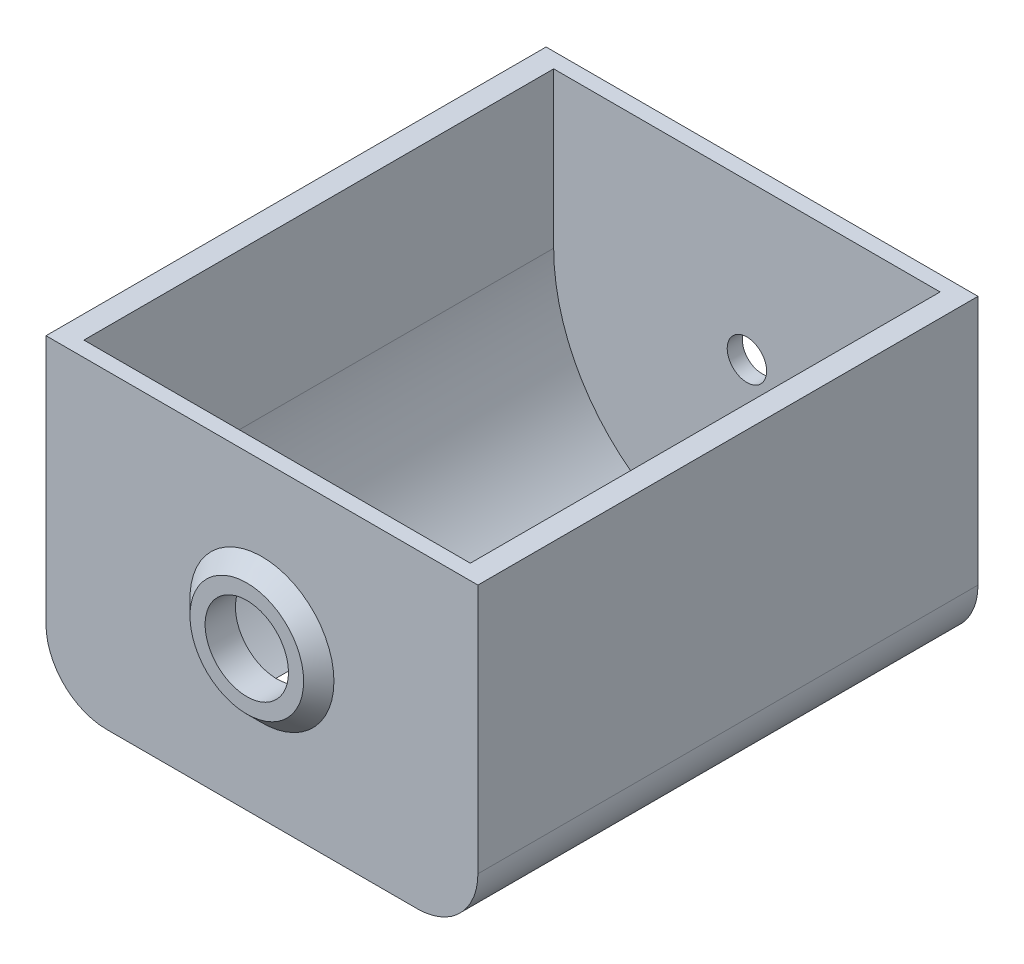
ISO-10303-21;
HEADER;
FILE_DESCRIPTION(('STEP AP214'),'2;1');
FILE_NAME('part.step','',(''),(''),'','','');
FILE_SCHEMA(('AUTOMOTIVE_DESIGN { 1 0 10303 214 1 1 1 1 }'));
ENDSEC;
DATA;
#1=APPLICATION_CONTEXT('core data for automotive mechanical design processes');
#2=APPLICATION_PROTOCOL_DEFINITION('international standard','automotive_design',2000,#1);
#3=PRODUCT_CONTEXT('',#1,'mechanical');
#4=PRODUCT('Part','Part','',(#3));
#5=PRODUCT_RELATED_PRODUCT_CATEGORY('part','',(#4));
#6=PRODUCT_DEFINITION_FORMATION('','',#4);
#7=PRODUCT_DEFINITION_CONTEXT('part definition',#1,'design');
#8=PRODUCT_DEFINITION('design','',#6,#7);
#9=PRODUCT_DEFINITION_SHAPE('','',#8);
#10=(LENGTH_UNIT() NAMED_UNIT(*) SI_UNIT(.MILLI.,.METRE.));
#11=(NAMED_UNIT(*) PLANE_ANGLE_UNIT() SI_UNIT($,.RADIAN.));
#12=(NAMED_UNIT(*) SI_UNIT($,.STERADIAN.) SOLID_ANGLE_UNIT());
#13=UNCERTAINTY_MEASURE_WITH_UNIT(LENGTH_MEASURE(1.E-05),#10,'distance_accuracy_value','');
#14=(GEOMETRIC_REPRESENTATION_CONTEXT(3) GLOBAL_UNCERTAINTY_ASSIGNED_CONTEXT((#13)) GLOBAL_UNIT_ASSIGNED_CONTEXT((#10,
#11,#12)) REPRESENTATION_CONTEXT('',''));
#15=CARTESIAN_POINT('',(0.,0.,0.));
#16=DIRECTION('',(0.,0.,1.));
#17=DIRECTION('',(1.,0.,0.));
#18=AXIS2_PLACEMENT_3D('',#15,#16,#17);
#19=CARTESIAN_POINT('',(0.,0.,64.));
#20=DIRECTION('',(0.,0.,1.));
#21=DIRECTION('',(1.,0.,0.));
#22=AXIS2_PLACEMENT_3D('',#19,#20,#21);
#23=PLANE('',#22);
#24=CARTESIAN_POINT('',(0.,0.,64.));
#25=DIRECTION('',(0.,0.,1.));
#26=DIRECTION('',(1.,0.,0.));
#27=AXIS2_PLACEMENT_3D('',#24,#25,#26);
#28=CIRCLE('',#27,9.49999999999997);
#29=CARTESIAN_POINT('',(9.49999999999997,0.,64.));
#30=VERTEX_POINT('',#29);
#31=EDGE_CURVE('E222',#30,#30,#28,.F.);
#32=ORIENTED_EDGE('',*,*,#31,.T.);
#33=EDGE_LOOP('',(#32));
#34=FACE_BOUND('',#33,.T.);
#35=DIRECTION('',(0.,-1.,0.));
#36=VECTOR('',#35,1.);
#37=CARTESIAN_POINT('',(-28.5,20.5,64.));
#38=LINE('',#37,#36);
#39=CARTESIAN_POINT('',(-28.5,20.5,64.));
#40=VERTEX_POINT('',#39);
#41=CARTESIAN_POINT('',(-28.5,-12.5,64.));
#42=VERTEX_POINT('',#41);
#43=EDGE_CURVE('E141',#40,#42,#38,.T.);
#44=ORIENTED_EDGE('',*,*,#43,.T.);
#45=CARTESIAN_POINT('',(-20.5,-12.5,64.));
#46=DIRECTION('',(0.,0.,1.));
#47=DIRECTION('',(1.,0.,0.));
#48=AXIS2_PLACEMENT_3D('',#45,#46,#47);
#49=CIRCLE('',#48,8.);
#50=CARTESIAN_POINT('',(-20.5,-20.5,64.));
#51=VERTEX_POINT('',#50);
#52=EDGE_CURVE('E43',#42,#51,#49,.T.);
#53=ORIENTED_EDGE('',*,*,#52,.T.);
#54=DIRECTION('',(1.,0.,0.));
#55=VECTOR('',#54,1.);
#56=CARTESIAN_POINT('',(-28.5,-20.5,64.));
#57=LINE('',#56,#55);
#58=CARTESIAN_POINT('',(20.5,-20.5,64.));
#59=VERTEX_POINT('',#58);
#60=EDGE_CURVE('E192',#51,#59,#57,.T.);
#61=ORIENTED_EDGE('',*,*,#60,.T.);
#62=CARTESIAN_POINT('',(20.5,-12.5,64.));
#63=DIRECTION('',(0.,0.,1.));
#64=DIRECTION('',(1.,0.,0.));
#65=AXIS2_PLACEMENT_3D('',#62,#63,#64);
#66=CIRCLE('',#65,8.);
#67=CARTESIAN_POINT('',(28.5,-12.5,64.));
#68=VERTEX_POINT('',#67);
#69=EDGE_CURVE('E50',#59,#68,#66,.T.);
#70=ORIENTED_EDGE('',*,*,#69,.T.);
#71=DIRECTION('',(0.,1.,0.));
#72=VECTOR('',#71,1.);
#73=CARTESIAN_POINT('',(28.5,20.5,64.));
#74=LINE('',#73,#72);
#75=CARTESIAN_POINT('',(28.5,20.5,64.));
#76=VERTEX_POINT('',#75);
#77=EDGE_CURVE('E195',#68,#76,#74,.T.);
#78=ORIENTED_EDGE('',*,*,#77,.T.);
#79=DIRECTION('',(-1.,0.,0.));
#80=VECTOR('',#79,1.);
#81=CARTESIAN_POINT('',(-28.5,20.5,64.));
#82=LINE('',#81,#80);
#83=EDGE_CURVE('E145',#76,#40,#82,.T.);
#84=ORIENTED_EDGE('',*,*,#83,.T.);
#85=EDGE_LOOP('',(#44,#53,#61,#70,#78,#84));
#86=FACE_BOUND('',#85,.T.);
#87=ADVANCED_FACE('F35',(#34,#86),#23,.T.);
#88=CARTESIAN_POINT('',(0.,0.,62.));
#89=DIRECTION('',(0.,0.,1.));
#90=DIRECTION('',(1.,0.,0.));
#91=AXIS2_PLACEMENT_3D('',#88,#89,#90);
#92=PLANE('',#91);
#93=CARTESIAN_POINT('',(0.,0.,62.));
#94=DIRECTION('',(0.,0.,1.));
#95=DIRECTION('',(1.,0.,0.));
#96=AXIS2_PLACEMENT_3D('',#93,#94,#95);
#97=CIRCLE('',#96,5.5);
#98=CARTESIAN_POINT('',(5.5,0.,62.));
#99=VERTEX_POINT('',#98);
#100=EDGE_CURVE('E187',#99,#99,#97,.T.);
#101=ORIENTED_EDGE('',*,*,#100,.T.);
#102=EDGE_LOOP('',(#101));
#103=FACE_BOUND('',#102,.T.);
#104=CARTESIAN_POINT('',(0.,0.,62.));
#105=DIRECTION('',(0.,0.,-1.));
#106=DIRECTION('',(1.,0.,0.));
#107=AXIS2_PLACEMENT_3D('',#104,#105,#106);
#108=CIRCLE('',#107,25.5);
#109=CARTESIAN_POINT('',(-15.1657508881031,-20.5,62.));
#110=VERTEX_POINT('',#109);
#111=CARTESIAN_POINT('',(-25.5,0.,62.));
#112=VERTEX_POINT('',#111);
#113=EDGE_CURVE('E167',#110,#112,#108,.T.);
#114=ORIENTED_EDGE('',*,*,#113,.T.);
#115=DIRECTION('',(0.,1.,0.));
#116=VECTOR('',#115,1.);
#117=CARTESIAN_POINT('',(-25.5,0.,62.));
#118=LINE('',#117,#116);
#119=CARTESIAN_POINT('',(-25.5,20.5,62.));
#120=VERTEX_POINT('',#119);
#121=EDGE_CURVE('E170',#112,#120,#118,.T.);
#122=ORIENTED_EDGE('',*,*,#121,.T.);
#123=DIRECTION('',(-1.,0.,0.));
#124=VECTOR('',#123,1.);
#125=CARTESIAN_POINT('',(-28.5,20.5,62.));
#126=LINE('',#125,#124);
#127=CARTESIAN_POINT('',(25.5,20.5,62.));
#128=VERTEX_POINT('',#127);
#129=EDGE_CURVE('E193',#128,#120,#126,.T.);
#130=ORIENTED_EDGE('',*,*,#129,.F.);
#131=DIRECTION('',(0.,-1.,0.));
#132=VECTOR('',#131,1.);
#133=CARTESIAN_POINT('',(25.5,0.,62.));
#134=LINE('',#133,#132);
#135=CARTESIAN_POINT('',(25.5,0.,62.));
#136=VERTEX_POINT('',#135);
#137=EDGE_CURVE('E204',#128,#136,#134,.T.);
#138=ORIENTED_EDGE('',*,*,#137,.T.);
#139=CARTESIAN_POINT('',(0.,0.,62.));
#140=DIRECTION('',(0.,0.,-1.));
#141=DIRECTION('',(1.,0.,0.));
#142=AXIS2_PLACEMENT_3D('',#139,#140,#141);
#143=CIRCLE('',#142,25.5);
#144=CARTESIAN_POINT('',(15.1657508881031,-20.5,62.));
#145=VERTEX_POINT('',#144);
#146=EDGE_CURVE('E201',#136,#145,#143,.T.);
#147=ORIENTED_EDGE('',*,*,#146,.T.);
#148=DIRECTION('',(1.,0.,0.));
#149=VECTOR('',#148,1.);
#150=CARTESIAN_POINT('',(-28.5,-20.5,62.));
#151=LINE('',#150,#149);
#152=EDGE_CURVE('E190',#110,#145,#151,.T.);
#153=ORIENTED_EDGE('',*,*,#152,.F.);
#154=EDGE_LOOP('',(#114,#122,#130,#138,#147,#153));
#155=FACE_BOUND('',#154,.T.);
#156=ADVANCED_FACE('F255',(#103,#155),#92,.F.);
#157=CARTESIAN_POINT('',(0.,0.,62.));
#158=DIRECTION('',(0.,0.,-1.));
#159=DIRECTION('',(-1.,0.,0.));
#160=AXIS2_PLACEMENT_3D('',#157,#158,#159);
#161=CYLINDRICAL_SURFACE('',#160,25.5);
#162=CARTESIAN_POINT('',(0.,0.,0.));
#163=DIRECTION('',(0.,0.,-1.));
#164=DIRECTION('',(1.,0.,0.));
#165=AXIS2_PLACEMENT_3D('',#162,#163,#164);
#166=CIRCLE('',#165,25.5);
#167=CARTESIAN_POINT('',(25.5,0.,0.));
#168=VERTEX_POINT('',#167);
#169=CARTESIAN_POINT('',(15.1657508881031,-20.5,0.));
#170=VERTEX_POINT('',#169);
#171=EDGE_CURVE('E144',#168,#170,#166,.T.);
#172=ORIENTED_EDGE('',*,*,#171,.T.);
#173=DIRECTION('',(0.,0.,-1.));
#174=VECTOR('',#173,1.);
#175=CARTESIAN_POINT('',(15.1657508881031,-20.5,62.));
#176=LINE('',#175,#174);
#177=EDGE_CURVE('E219',#145,#170,#176,.T.);
#178=ORIENTED_EDGE('',*,*,#177,.F.);
#179=ORIENTED_EDGE('',*,*,#146,.F.);
#180=DIRECTION('',(0.,0.,-1.));
#181=VECTOR('',#180,1.);
#182=CARTESIAN_POINT('',(25.5,0.,62.));
#183=LINE('',#182,#181);
#184=EDGE_CURVE('E208',#136,#168,#183,.T.);
#185=ORIENTED_EDGE('',*,*,#184,.T.);
#186=EDGE_LOOP('',(#172,#178,#179,#185));
#187=FACE_BOUND('',#186,.T.);
#188=ADVANCED_FACE('F261',(#187),#161,.F.);
#189=CARTESIAN_POINT('',(28.5,-20.5,62.));
#190=DIRECTION('',(0.,1.,0.));
#191=DIRECTION('',(-1.,0.,0.));
#192=AXIS2_PLACEMENT_3D('',#189,#190,#191);
#193=PLANE('',#192);
#194=ORIENTED_EDGE('',*,*,#60,.F.);
#195=DIRECTION('',(0.,0.,-1.));
#196=VECTOR('',#195,1.);
#197=CARTESIAN_POINT('',(-20.5,-20.5,62.));
#198=LINE('',#197,#196);
#199=CARTESIAN_POINT('',(-20.5,-20.5,-2.));
#200=VERTEX_POINT('',#199);
#201=EDGE_CURVE('E227',#51,#200,#198,.T.);
#202=ORIENTED_EDGE('',*,*,#201,.T.);
#203=DIRECTION('',(-1.,0.,0.));
#204=VECTOR('',#203,1.);
#205=CARTESIAN_POINT('',(28.5,-20.5,-2.));
#206=LINE('',#205,#204);
#207=CARTESIAN_POINT('',(20.5,-20.5,-2.));
#208=VERTEX_POINT('',#207);
#209=EDGE_CURVE('E136',#208,#200,#206,.T.);
#210=ORIENTED_EDGE('',*,*,#209,.F.);
#211=DIRECTION('',(0.,0.,-1.));
#212=VECTOR('',#211,1.);
#213=CARTESIAN_POINT('',(20.5,-20.5,62.));
#214=LINE('',#213,#212);
#215=EDGE_CURVE('E225',#208,#59,#214,.F.);
#216=ORIENTED_EDGE('',*,*,#215,.T.);
#217=EDGE_LOOP('',(#194,#202,#210,#216));
#218=FACE_BOUND('',#217,.T.);
#219=ORIENTED_EDGE('',*,*,#177,.T.);
#220=DIRECTION('',(-1.,0.,0.));
#221=VECTOR('',#220,1.);
#222=CARTESIAN_POINT('',(28.5,-20.5,0.));
#223=LINE('',#222,#221);
#224=CARTESIAN_POINT('',(-15.1657508881031,-20.5,0.));
#225=VERTEX_POINT('',#224);
#226=EDGE_CURVE('E157',#170,#225,#223,.T.);
#227=ORIENTED_EDGE('',*,*,#226,.T.);
#228=DIRECTION('',(0.,0.,-1.));
#229=VECTOR('',#228,1.);
#230=CARTESIAN_POINT('',(-15.1657508881031,-20.5,62.));
#231=LINE('',#230,#229);
#232=EDGE_CURVE('E184',#110,#225,#231,.T.);
#233=ORIENTED_EDGE('',*,*,#232,.F.);
#234=ORIENTED_EDGE('',*,*,#152,.T.);
#235=EDGE_LOOP('',(#219,#227,#233,#234));
#236=FACE_BOUND('',#235,.T.);
#237=ADVANCED_FACE('F239',(#218,#236),#193,.F.);
#238=CARTESIAN_POINT('',(28.5,-20.5,62.));
#239=DIRECTION('',(-1.,0.,0.));
#240=DIRECTION('',(0.,0.,1.));
#241=AXIS2_PLACEMENT_3D('',#238,#239,#240);
#242=PLANE('',#241);
#243=ORIENTED_EDGE('',*,*,#77,.F.);
#244=DIRECTION('',(0.,0.,-1.));
#245=VECTOR('',#244,1.);
#246=CARTESIAN_POINT('',(28.5,-12.5,62.));
#247=LINE('',#246,#245);
#248=CARTESIAN_POINT('',(28.5,-12.5,-2.));
#249=VERTEX_POINT('',#248);
#250=EDGE_CURVE('E11',#68,#249,#247,.T.);
#251=ORIENTED_EDGE('',*,*,#250,.T.);
#252=DIRECTION('',(0.,-1.,0.));
#253=VECTOR('',#252,1.);
#254=CARTESIAN_POINT('',(28.5,20.5,-2.));
#255=LINE('',#254,#253);
#256=CARTESIAN_POINT('',(28.5,20.5,-2.));
#257=VERTEX_POINT('',#256);
#258=EDGE_CURVE('E162',#257,#249,#255,.T.);
#259=ORIENTED_EDGE('',*,*,#258,.F.);
#260=DIRECTION('',(0.,0.,-1.));
#261=VECTOR('',#260,1.);
#262=CARTESIAN_POINT('',(28.5,20.5,62.));
#263=LINE('',#262,#261);
#264=EDGE_CURVE('E149',#76,#257,#263,.T.);
#265=ORIENTED_EDGE('',*,*,#264,.F.);
#266=EDGE_LOOP('',(#243,#251,#259,#265));
#267=FACE_BOUND('',#266,.T.);
#268=ADVANCED_FACE('F276',(#267),#242,.F.);
#269=CARTESIAN_POINT('',(28.5,20.5,62.));
#270=DIRECTION('',(0.,-1.,0.));
#271=DIRECTION('',(0.,0.,-1.));
#272=AXIS2_PLACEMENT_3D('',#269,#270,#271);
#273=PLANE('',#272);
#274=DIRECTION('',(1.,0.,0.));
#275=VECTOR('',#274,1.);
#276=CARTESIAN_POINT('',(28.5,20.5,0.));
#277=LINE('',#276,#275);
#278=CARTESIAN_POINT('',(-25.5,20.5,0.));
#279=VERTEX_POINT('',#278);
#280=CARTESIAN_POINT('',(25.5,20.5,0.));
#281=VERTEX_POINT('',#280);
#282=EDGE_CURVE('E160',#279,#281,#277,.T.);
#283=ORIENTED_EDGE('',*,*,#282,.T.);
#284=DIRECTION('',(0.,0.,-1.));
#285=VECTOR('',#284,1.);
#286=CARTESIAN_POINT('',(25.5,20.5,62.));
#287=LINE('',#286,#285);
#288=EDGE_CURVE('E215',#128,#281,#287,.T.);
#289=ORIENTED_EDGE('',*,*,#288,.F.);
#290=ORIENTED_EDGE('',*,*,#129,.T.);
#291=DIRECTION('',(0.,0.,-1.));
#292=VECTOR('',#291,1.);
#293=CARTESIAN_POINT('',(-25.5,20.5,62.));
#294=LINE('',#293,#292);
#295=EDGE_CURVE('E174',#120,#279,#294,.T.);
#296=ORIENTED_EDGE('',*,*,#295,.T.);
#297=EDGE_LOOP('',(#283,#289,#290,#296));
#298=FACE_BOUND('',#297,.T.);
#299=ORIENTED_EDGE('',*,*,#264,.T.);
#300=DIRECTION('',(1.,0.,0.));
#301=VECTOR('',#300,1.);
#302=CARTESIAN_POINT('',(28.5,20.5,-2.));
#303=LINE('',#302,#301);
#304=CARTESIAN_POINT('',(-28.5,20.5,-2.));
#305=VERTEX_POINT('',#304);
#306=EDGE_CURVE('E133',#305,#257,#303,.T.);
#307=ORIENTED_EDGE('',*,*,#306,.F.);
#308=DIRECTION('',(0.,0.,-1.));
#309=VECTOR('',#308,1.);
#310=CARTESIAN_POINT('',(-28.5,20.5,64.));
#311=LINE('',#310,#309);
#312=EDGE_CURVE('E139',#40,#305,#311,.T.);
#313=ORIENTED_EDGE('',*,*,#312,.F.);
#314=ORIENTED_EDGE('',*,*,#83,.F.);
#315=EDGE_LOOP('',(#299,#307,#313,#314));
#316=FACE_BOUND('',#315,.T.);
#317=ADVANCED_FACE('F147',(#298,#316),#273,.F.);
#318=CARTESIAN_POINT('',(25.5,0.,62.));
#319=DIRECTION('',(1.,0.,0.));
#320=DIRECTION('',(0.,0.,-1.));
#321=AXIS2_PLACEMENT_3D('',#318,#319,#320);
#322=PLANE('',#321);
#323=DIRECTION('',(0.,-1.,0.));
#324=VECTOR('',#323,1.);
#325=CARTESIAN_POINT('',(25.5,0.,0.));
#326=LINE('',#325,#324);
#327=EDGE_CURVE('E205',#281,#168,#326,.T.);
#328=ORIENTED_EDGE('',*,*,#327,.T.);
#329=ORIENTED_EDGE('',*,*,#184,.F.);
#330=ORIENTED_EDGE('',*,*,#137,.F.);
#331=ORIENTED_EDGE('',*,*,#288,.T.);
#332=EDGE_LOOP('',(#328,#329,#330,#331));
#333=FACE_BOUND('',#332,.T.);
#334=ADVANCED_FACE('F270',(#333),#322,.F.);
#335=CARTESIAN_POINT('',(-28.5,20.5,64.));
#336=DIRECTION('',(1.,0.,0.));
#337=DIRECTION('',(0.,0.,-1.));
#338=AXIS2_PLACEMENT_3D('',#335,#336,#337);
#339=PLANE('',#338);
#340=DIRECTION('',(0.,1.,0.));
#341=VECTOR('',#340,1.);
#342=CARTESIAN_POINT('',(-28.5,20.5,-2.));
#343=LINE('',#342,#341);
#344=CARTESIAN_POINT('',(-28.5,-12.5,-2.));
#345=VERTEX_POINT('',#344);
#346=EDGE_CURVE('E126',#345,#305,#343,.T.);
#347=ORIENTED_EDGE('',*,*,#346,.F.);
#348=DIRECTION('',(0.,0.,-1.));
#349=VECTOR('',#348,1.);
#350=CARTESIAN_POINT('',(-28.5,-12.5,64.));
#351=LINE('',#350,#349);
#352=EDGE_CURVE('E58',#345,#42,#351,.F.);
#353=ORIENTED_EDGE('',*,*,#352,.T.);
#354=ORIENTED_EDGE('',*,*,#43,.F.);
#355=ORIENTED_EDGE('',*,*,#312,.T.);
#356=EDGE_LOOP('',(#347,#353,#354,#355));
#357=FACE_BOUND('',#356,.T.);
#358=ADVANCED_FACE('F140',(#357),#339,.F.);
#359=CARTESIAN_POINT('',(0.,0.,64.));
#360=DIRECTION('',(0.,0.,-1.));
#361=DIRECTION('',(-1.,0.,0.));
#362=AXIS2_PLACEMENT_3D('',#359,#360,#361);
#363=CYLINDRICAL_SURFACE('',#362,5.5);
#364=ORIENTED_EDGE('',*,*,#100,.F.);
#365=EDGE_LOOP('',(#364));
#366=FACE_BOUND('',#365,.T.);
#367=CARTESIAN_POINT('',(0.,0.,66.));
#368=DIRECTION('',(0.,0.,1.));
#369=DIRECTION('',(1.,0.,0.));
#370=AXIS2_PLACEMENT_3D('',#367,#368,#369);
#371=CIRCLE('',#370,5.5);
#372=CARTESIAN_POINT('',(5.5,0.,66.));
#373=VERTEX_POINT('',#372);
#374=EDGE_CURVE('E150',#373,#373,#371,.T.);
#375=ORIENTED_EDGE('',*,*,#374,.T.);
#376=EDGE_LOOP('',(#375));
#377=FACE_BOUND('',#376,.T.);
#378=ADVANCED_FACE('F265',(#366,#377),#363,.F.);
#379=CARTESIAN_POINT('',(0.,0.,62.));
#380=DIRECTION('',(0.,0.,-1.));
#381=DIRECTION('',(-1.,0.,0.));
#382=AXIS2_PLACEMENT_3D('',#379,#380,#381);
#383=CYLINDRICAL_SURFACE('',#382,25.5);
#384=CARTESIAN_POINT('',(0.,0.,0.));
#385=DIRECTION('',(0.,0.,-1.));
#386=DIRECTION('',(1.,0.,0.));
#387=AXIS2_PLACEMENT_3D('',#384,#385,#386);
#388=CIRCLE('',#387,25.5);
#389=CARTESIAN_POINT('',(-25.5,0.,0.));
#390=VERTEX_POINT('',#389);
#391=EDGE_CURVE('E166',#225,#390,#388,.T.);
#392=ORIENTED_EDGE('',*,*,#391,.T.);
#393=DIRECTION('',(0.,0.,-1.));
#394=VECTOR('',#393,1.);
#395=CARTESIAN_POINT('',(-25.5,0.,62.));
#396=LINE('',#395,#394);
#397=EDGE_CURVE('E181',#112,#390,#396,.T.);
#398=ORIENTED_EDGE('',*,*,#397,.F.);
#399=ORIENTED_EDGE('',*,*,#113,.F.);
#400=ORIENTED_EDGE('',*,*,#232,.T.);
#401=EDGE_LOOP('',(#392,#398,#399,#400));
#402=FACE_BOUND('',#401,.T.);
#403=ADVANCED_FACE('F306',(#402),#383,.F.);
#404=CARTESIAN_POINT('',(-25.5,0.,62.));
#405=DIRECTION('',(-1.,0.,0.));
#406=DIRECTION('',(0.,-1.,0.));
#407=AXIS2_PLACEMENT_3D('',#404,#405,#406);
#408=PLANE('',#407);
#409=DIRECTION('',(0.,1.,0.));
#410=VECTOR('',#409,1.);
#411=CARTESIAN_POINT('',(-25.5,0.,0.));
#412=LINE('',#411,#410);
#413=EDGE_CURVE('E171',#390,#279,#412,.T.);
#414=ORIENTED_EDGE('',*,*,#413,.T.);
#415=ORIENTED_EDGE('',*,*,#295,.F.);
#416=ORIENTED_EDGE('',*,*,#121,.F.);
#417=ORIENTED_EDGE('',*,*,#397,.T.);
#418=EDGE_LOOP('',(#414,#415,#416,#417));
#419=FACE_BOUND('',#418,.T.);
#420=ADVANCED_FACE('F296',(#419),#408,.F.);
#421=CARTESIAN_POINT('',(0.,0.,66.));
#422=DIRECTION('',(0.,0.,1.));
#423=DIRECTION('',(1.,0.,0.));
#424=AXIS2_PLACEMENT_3D('',#421,#422,#423);
#425=PLANE('',#424);
#426=CARTESIAN_POINT('',(0.,0.,66.));
#427=DIRECTION('',(0.,0.,1.));
#428=DIRECTION('',(1.,0.,0.));
#429=AXIS2_PLACEMENT_3D('',#426,#427,#428);
#430=CIRCLE('',#429,7.5);
#431=CARTESIAN_POINT('',(7.5,0.,66.));
#432=VERTEX_POINT('',#431);
#433=EDGE_CURVE('E153',#432,#432,#430,.T.);
#434=ORIENTED_EDGE('',*,*,#433,.T.);
#435=EDGE_LOOP('',(#434));
#436=FACE_BOUND('',#435,.T.);
#437=ORIENTED_EDGE('',*,*,#374,.F.);
#438=EDGE_LOOP('',(#437));
#439=FACE_BOUND('',#438,.T.);
#440=ADVANCED_FACE('F288',(#436,#439),#425,.T.);
#441=CARTESIAN_POINT('',(0.,0.,66.));
#442=DIRECTION('',(0.,0.,-1.));
#443=DIRECTION('',(-1.,0.,0.));
#444=AXIS2_PLACEMENT_3D('',#441,#442,#443);
#445=CONICAL_SURFACE('',#444,7.5,0.78539816339744);
#446=ORIENTED_EDGE('',*,*,#31,.F.);
#447=EDGE_LOOP('',(#446));
#448=FACE_BOUND('',#447,.T.);
#449=ORIENTED_EDGE('',*,*,#433,.F.);
#450=EDGE_LOOP('',(#449));
#451=FACE_BOUND('',#450,.T.);
#452=ADVANCED_FACE('F285',(#448,#451),#445,.T.);
#453=CARTESIAN_POINT('',(0.,0.,0.));
#454=DIRECTION('',(0.,0.,-1.));
#455=DIRECTION('',(-1.,0.,0.));
#456=AXIS2_PLACEMENT_3D('',#453,#454,#455);
#457=PLANE('',#456);
#458=CARTESIAN_POINT('',(0.,0.,0.));
#459=DIRECTION('',(0.,0.,-1.));
#460=DIRECTION('',(-1.,0.,0.));
#461=AXIS2_PLACEMENT_3D('',#458,#459,#460);
#462=CIRCLE('',#461,2.6);
#463=CARTESIAN_POINT('',(-2.6,0.,0.));
#464=VERTEX_POINT('',#463);
#465=EDGE_CURVE('E463',#464,#464,#462,.T.);
#466=ORIENTED_EDGE('',*,*,#465,.T.);
#467=EDGE_LOOP('',(#466));
#468=FACE_BOUND('',#467,.T.);
#469=ORIENTED_EDGE('',*,*,#226,.F.);
#470=ORIENTED_EDGE('',*,*,#171,.F.);
#471=ORIENTED_EDGE('',*,*,#327,.F.);
#472=ORIENTED_EDGE('',*,*,#282,.F.);
#473=ORIENTED_EDGE('',*,*,#413,.F.);
#474=ORIENTED_EDGE('',*,*,#391,.F.);
#475=EDGE_LOOP('',(#469,#470,#471,#472,#473,#474));
#476=FACE_BOUND('',#475,.T.);
#477=ADVANCED_FACE('F287',(#468,#476),#457,.F.);
#478=CARTESIAN_POINT('',(0.,0.,-2.));
#479=DIRECTION('',(0.,0.,-1.));
#480=DIRECTION('',(-1.,0.,0.));
#481=AXIS2_PLACEMENT_3D('',#478,#479,#480);
#482=PLANE('',#481);
#483=ORIENTED_EDGE('',*,*,#209,.T.);
#484=CARTESIAN_POINT('',(-20.5,-12.5,-2.));
#485=DIRECTION('',(0.,0.,-1.));
#486=DIRECTION('',(-1.,0.,0.));
#487=AXIS2_PLACEMENT_3D('',#484,#485,#486);
#488=CIRCLE('',#487,8.);
#489=EDGE_CURVE('E135',#200,#345,#488,.T.);
#490=ORIENTED_EDGE('',*,*,#489,.T.);
#491=ORIENTED_EDGE('',*,*,#346,.T.);
#492=ORIENTED_EDGE('',*,*,#306,.T.);
#493=ORIENTED_EDGE('',*,*,#258,.T.);
#494=CARTESIAN_POINT('',(20.5,-12.5,-2.));
#495=DIRECTION('',(0.,0.,-1.));
#496=DIRECTION('',(-1.,0.,0.));
#497=AXIS2_PLACEMENT_3D('',#494,#495,#496);
#498=CIRCLE('',#497,8.);
#499=EDGE_CURVE('E230',#249,#208,#498,.T.);
#500=ORIENTED_EDGE('',*,*,#499,.T.);
#501=EDGE_LOOP('',(#483,#490,#491,#492,#493,#500));
#502=FACE_BOUND('',#501,.T.);
#503=CARTESIAN_POINT('',(0.,0.,-2.));
#504=DIRECTION('',(0.,0.,-1.));
#505=DIRECTION('',(-1.,0.,0.));
#506=AXIS2_PLACEMENT_3D('',#503,#504,#505);
#507=CIRCLE('',#506,2.6);
#508=CARTESIAN_POINT('',(-2.6,0.,-2.));
#509=VERTEX_POINT('',#508);
#510=EDGE_CURVE('E161',#509,#509,#507,.T.);
#511=ORIENTED_EDGE('',*,*,#510,.F.);
#512=EDGE_LOOP('',(#511));
#513=FACE_BOUND('',#512,.T.);
#514=ADVANCED_FACE('F129',(#502,#513),#482,.T.);
#515=CARTESIAN_POINT('',(0.,0.,-2.));
#516=DIRECTION('',(0.,0.,1.));
#517=DIRECTION('',(1.,0.,0.));
#518=AXIS2_PLACEMENT_3D('',#515,#516,#517);
#519=CYLINDRICAL_SURFACE('',#518,2.6);
#520=ORIENTED_EDGE('',*,*,#510,.T.);
#521=EDGE_LOOP('',(#520));
#522=FACE_BOUND('',#521,.T.);
#523=ORIENTED_EDGE('',*,*,#465,.F.);
#524=EDGE_LOOP('',(#523));
#525=FACE_BOUND('',#524,.T.);
#526=ADVANCED_FACE('F245',(#522,#525),#519,.F.);
#527=CARTESIAN_POINT('',(-20.5,-12.5,62.));
#528=DIRECTION('',(0.,0.,-1.));
#529=DIRECTION('',(-1.,0.,0.));
#530=AXIS2_PLACEMENT_3D('',#527,#528,#529);
#531=CYLINDRICAL_SURFACE('',#530,8.);
#532=ORIENTED_EDGE('',*,*,#52,.F.);
#533=ORIENTED_EDGE('',*,*,#352,.F.);
#534=ORIENTED_EDGE('',*,*,#489,.F.);
#535=ORIENTED_EDGE('',*,*,#201,.F.);
#536=EDGE_LOOP('',(#532,#533,#534,#535));
#537=FACE_BOUND('',#536,.T.);
#538=ADVANCED_FACE('F243',(#537),#531,.T.);
#539=CARTESIAN_POINT('',(20.5,-12.5,62.));
#540=DIRECTION('',(0.,0.,-1.));
#541=DIRECTION('',(-1.,0.,0.));
#542=AXIS2_PLACEMENT_3D('',#539,#540,#541);
#543=CYLINDRICAL_SURFACE('',#542,8.);
#544=ORIENTED_EDGE('',*,*,#69,.F.);
#545=ORIENTED_EDGE('',*,*,#215,.F.);
#546=ORIENTED_EDGE('',*,*,#499,.F.);
#547=ORIENTED_EDGE('',*,*,#250,.F.);
#548=EDGE_LOOP('',(#544,#545,#546,#547));
#549=FACE_BOUND('',#548,.T.);
#550=ADVANCED_FACE('F37',(#549),#543,.T.);
#551=CLOSED_SHELL('',(#87,#156,#188,#237,#268,#317,#334,#358,#378,#403,#420,#440,#452,#477,#514,
#526,#538,#550));
#552=MANIFOLD_SOLID_BREP('B2',#551);
#553=ADVANCED_BREP_SHAPE_REPRESENTATION('',(#18,#552),#14);
#554=SHAPE_DEFINITION_REPRESENTATION(#9,#553);
ENDSEC;
END-ISO-10303-21;
